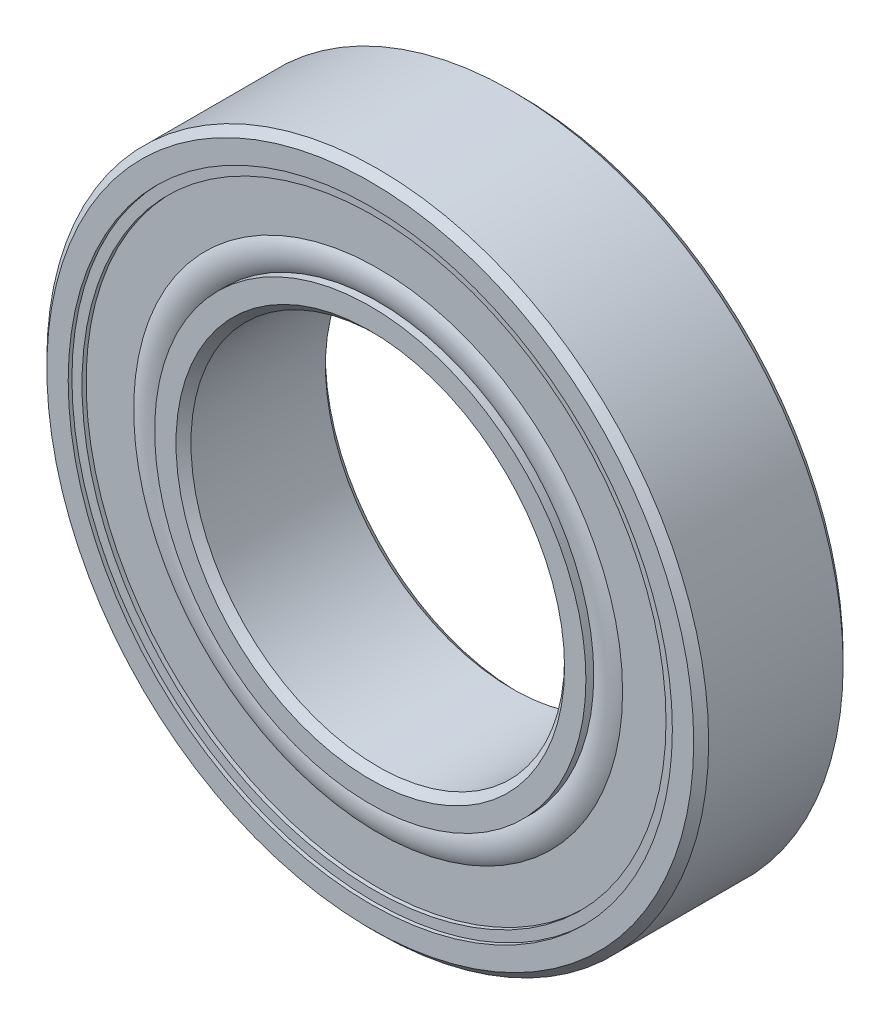
ISO-10303-21;
HEADER;
FILE_DESCRIPTION(('STEP AP214'),'2;1');
FILE_NAME('part.step','',(''),(''),'','','');
FILE_SCHEMA(('AUTOMOTIVE_DESIGN { 1 0 10303 214 1 1 1 1 }'));
ENDSEC;
DATA;
#1=APPLICATION_CONTEXT('core data for automotive mechanical design processes');
#2=APPLICATION_PROTOCOL_DEFINITION('international standard','automotive_design',2000,#1);
#3=PRODUCT_CONTEXT('',#1,'mechanical');
#4=PRODUCT('Part','Part','',(#3));
#5=PRODUCT_RELATED_PRODUCT_CATEGORY('part','',(#4));
#6=PRODUCT_DEFINITION_FORMATION('','',#4);
#7=PRODUCT_DEFINITION_CONTEXT('part definition',#1,'design');
#8=PRODUCT_DEFINITION('design','',#6,#7);
#9=PRODUCT_DEFINITION_SHAPE('','',#8);
#10=(LENGTH_UNIT() NAMED_UNIT(*) SI_UNIT(.MILLI.,.METRE.));
#11=(NAMED_UNIT(*) PLANE_ANGLE_UNIT() SI_UNIT($,.RADIAN.));
#12=(NAMED_UNIT(*) SI_UNIT($,.STERADIAN.) SOLID_ANGLE_UNIT());
#13=UNCERTAINTY_MEASURE_WITH_UNIT(LENGTH_MEASURE(1.E-05),#10,'distance_accuracy_value','');
#14=(GEOMETRIC_REPRESENTATION_CONTEXT(3) GLOBAL_UNCERTAINTY_ASSIGNED_CONTEXT((#13)) GLOBAL_UNIT_ASSIGNED_CONTEXT((#10,
#11,#12)) REPRESENTATION_CONTEXT('',''));
#15=CARTESIAN_POINT('',(0.,0.,0.));
#16=DIRECTION('',(0.,0.,1.));
#17=DIRECTION('',(1.,0.,0.));
#18=AXIS2_PLACEMENT_3D('',#15,#16,#17);
#19=CARTESIAN_POINT('',(0.,0.,-4.09483501012353));
#20=DIRECTION('',(0.,0.,1.));
#21=DIRECTION('',(1.,0.,0.));
#22=AXIS2_PLACEMENT_3D('',#19,#20,#21);
#23=TOROIDAL_SURFACE('',#22,21.55,2.55516498987648);
#24=CARTESIAN_POINT('',(0.,0.,-6.26425155046115));
#25=DIRECTION('',(0.,0.,1.));
#26=DIRECTION('',(1.,0.,0.));
#27=AXIS2_PLACEMENT_3D('',#24,#25,#26);
#28=CIRCLE('',#27,22.9);
#29=CARTESIAN_POINT('',(22.9,0.,-6.26425155046115));
#30=VERTEX_POINT('',#29);
#31=EDGE_CURVE('E11',#30,#30,#28,.T.);
#32=ORIENTED_EDGE('',*,*,#31,.F.);
#33=EDGE_LOOP('',(#32));
#34=FACE_BOUND('',#33,.T.);
#35=CARTESIAN_POINT('',(0.,0.,-6.26425155046115));
#36=DIRECTION('',(0.,0.,1.));
#37=DIRECTION('',(1.,0.,0.));
#38=AXIS2_PLACEMENT_3D('',#35,#36,#37);
#39=CIRCLE('',#38,20.2);
#40=CARTESIAN_POINT('',(20.2,0.,-6.26425155046115));
#41=VERTEX_POINT('',#40);
#42=EDGE_CURVE('E83',#41,#41,#39,.T.);
#43=ORIENTED_EDGE('',*,*,#42,.T.);
#44=EDGE_LOOP('',(#43));
#45=FACE_BOUND('',#44,.T.);
#46=ADVANCED_FACE('F50',(#34,#45),#23,.T.);
#47=CARTESIAN_POINT('',(0.,27.355,-6.26425155046115));
#48=DIRECTION('',(0.,0.,1.));
#49=DIRECTION('',(1.,0.,0.));
#50=AXIS2_PLACEMENT_3D('',#47,#48,#49);
#51=PLANE('',#50);
#52=CARTESIAN_POINT('',(0.,0.,-6.26425155046115));
#53=DIRECTION('',(0.,0.,1.));
#54=DIRECTION('',(1.,0.,0.));
#55=AXIS2_PLACEMENT_3D('',#52,#53,#54);
#56=CIRCLE('',#55,27.355);
#57=CARTESIAN_POINT('',(27.355,0.,-6.26425155046115));
#58=VERTEX_POINT('',#57);
#59=EDGE_CURVE('E57',#58,#58,#56,.T.);
#60=ORIENTED_EDGE('',*,*,#59,.F.);
#61=EDGE_LOOP('',(#60));
#62=FACE_BOUND('',#61,.T.);
#63=ORIENTED_EDGE('',*,*,#31,.T.);
#64=EDGE_LOOP('',(#63));
#65=FACE_BOUND('',#64,.T.);
#66=ADVANCED_FACE('F116',(#62,#65),#51,.F.);
#67=CARTESIAN_POINT('',(0.,0.,7.));
#68=DIRECTION('',(0.,0.,1.));
#69=DIRECTION('',(1.,0.,0.));
#70=AXIS2_PLACEMENT_3D('',#67,#68,#69);
#71=CYLINDRICAL_SURFACE('',#70,27.355);
#72=CARTESIAN_POINT('',(0.,0.,-6.65));
#73=DIRECTION('',(0.,0.,1.));
#74=DIRECTION('',(1.,0.,0.));
#75=AXIS2_PLACEMENT_3D('',#72,#73,#74);
#76=CIRCLE('',#75,27.355);
#77=CARTESIAN_POINT('',(27.355,0.,-6.65));
#78=VERTEX_POINT('',#77);
#79=EDGE_CURVE('E63',#78,#78,#76,.T.);
#80=ORIENTED_EDGE('',*,*,#79,.F.);
#81=EDGE_LOOP('',(#80));
#82=FACE_BOUND('',#81,.T.);
#83=ORIENTED_EDGE('',*,*,#59,.T.);
#84=EDGE_LOOP('',(#83));
#85=FACE_BOUND('',#84,.T.);
#86=ADVANCED_FACE('F111',(#82,#85),#71,.F.);
#87=CARTESIAN_POINT('',(0.,28.3,-6.65));
#88=DIRECTION('',(0.,0.,1.));
#89=DIRECTION('',(1.,0.,0.));
#90=AXIS2_PLACEMENT_3D('',#87,#88,#89);
#91=PLANE('',#90);
#92=CARTESIAN_POINT('',(0.,0.,-6.65));
#93=DIRECTION('',(0.,0.,1.));
#94=DIRECTION('',(1.,0.,0.));
#95=AXIS2_PLACEMENT_3D('',#92,#93,#94);
#96=CIRCLE('',#95,28.3);
#97=CARTESIAN_POINT('',(28.3,0.,-6.65));
#98=VERTEX_POINT('',#97);
#99=EDGE_CURVE('E69',#98,#98,#96,.T.);
#100=ORIENTED_EDGE('',*,*,#99,.F.);
#101=EDGE_LOOP('',(#100));
#102=FACE_BOUND('',#101,.T.);
#103=ORIENTED_EDGE('',*,*,#79,.T.);
#104=EDGE_LOOP('',(#103));
#105=FACE_BOUND('',#104,.T.);
#106=ADVANCED_FACE('F105',(#102,#105),#91,.F.);
#107=CARTESIAN_POINT('',(0.,0.,7.));
#108=DIRECTION('',(0.,0.,1.));
#109=DIRECTION('',(1.,0.,0.));
#110=AXIS2_PLACEMENT_3D('',#107,#108,#109);
#111=CYLINDRICAL_SURFACE('',#110,28.3);
#112=CARTESIAN_POINT('',(0.,0.,-5.10700620184458));
#113=DIRECTION('',(0.,0.,1.));
#114=DIRECTION('',(1.,0.,0.));
#115=AXIS2_PLACEMENT_3D('',#112,#113,#114);
#116=CIRCLE('',#115,28.3);
#117=CARTESIAN_POINT('',(28.3,0.,-5.10700620184458));
#118=VERTEX_POINT('',#117);
#119=EDGE_CURVE('E75',#118,#118,#116,.T.);
#120=ORIENTED_EDGE('',*,*,#119,.F.);
#121=EDGE_LOOP('',(#120));
#122=FACE_BOUND('',#121,.T.);
#123=ORIENTED_EDGE('',*,*,#99,.T.);
#124=EDGE_LOOP('',(#123));
#125=FACE_BOUND('',#124,.T.);
#126=ADVANCED_FACE('F99',(#122,#125),#111,.T.);
#127=CARTESIAN_POINT('',(0.,28.3,-5.10700620184458));
#128=DIRECTION('',(0.,0.,-1.));
#129=DIRECTION('',(-1.,0.,0.));
#130=AXIS2_PLACEMENT_3D('',#127,#128,#129);
#131=PLANE('',#130);
#132=CARTESIAN_POINT('',(0.,0.,-5.10700620184458));
#133=DIRECTION('',(0.,0.,1.));
#134=DIRECTION('',(1.,0.,0.));
#135=AXIS2_PLACEMENT_3D('',#132,#133,#134);
#136=CIRCLE('',#135,20.2);
#137=CARTESIAN_POINT('',(20.2,0.,-5.10700620184458));
#138=VERTEX_POINT('',#137);
#139=EDGE_CURVE('E79',#138,#138,#136,.T.);
#140=ORIENTED_EDGE('',*,*,#139,.F.);
#141=EDGE_LOOP('',(#140));
#142=FACE_BOUND('',#141,.T.);
#143=ORIENTED_EDGE('',*,*,#119,.T.);
#144=EDGE_LOOP('',(#143));
#145=FACE_BOUND('',#144,.T.);
#146=ADVANCED_FACE('F93',(#142,#145),#131,.F.);
#147=CARTESIAN_POINT('',(0.,0.,7.));
#148=DIRECTION('',(0.,0.,1.));
#149=DIRECTION('',(1.,0.,0.));
#150=AXIS2_PLACEMENT_3D('',#147,#148,#149);
#151=CYLINDRICAL_SURFACE('',#150,20.2);
#152=ORIENTED_EDGE('',*,*,#42,.F.);
#153=EDGE_LOOP('',(#152));
#154=FACE_BOUND('',#153,.T.);
#155=ORIENTED_EDGE('',*,*,#139,.T.);
#156=EDGE_LOOP('',(#155));
#157=FACE_BOUND('',#156,.T.);
#158=ADVANCED_FACE('F90',(#154,#157),#151,.F.);
#159=CLOSED_SHELL('',(#46,#66,#86,#106,#126,#146,#158));
#160=MANIFOLD_SOLID_BREP('B2',#159);
#161=CARTESIAN_POINT('',(0.,28.3,6.65));
#162=DIRECTION('',(0.,0.,-1.));
#163=DIRECTION('',(-1.,0.,0.));
#164=AXIS2_PLACEMENT_3D('',#161,#162,#163);
#165=PLANE('',#164);
#166=CARTESIAN_POINT('',(0.,0.,6.65));
#167=DIRECTION('',(0.,0.,1.));
#168=DIRECTION('',(1.,0.,0.));
#169=AXIS2_PLACEMENT_3D('',#166,#167,#168);
#170=CIRCLE('',#169,27.355);
#171=CARTESIAN_POINT('',(27.355,0.,6.65));
#172=VERTEX_POINT('',#171);
#173=EDGE_CURVE('E210',#172,#172,#170,.T.);
#174=ORIENTED_EDGE('',*,*,#173,.F.);
#175=EDGE_LOOP('',(#174));
#176=FACE_BOUND('',#175,.T.);
#177=CARTESIAN_POINT('',(0.,0.,6.65));
#178=DIRECTION('',(0.,0.,1.));
#179=DIRECTION('',(1.,0.,0.));
#180=AXIS2_PLACEMENT_3D('',#177,#178,#179);
#181=CIRCLE('',#180,28.3);
#182=CARTESIAN_POINT('',(28.3,0.,6.65));
#183=VERTEX_POINT('',#182);
#184=EDGE_CURVE('E49',#183,#183,#181,.T.);
#185=ORIENTED_EDGE('',*,*,#184,.T.);
#186=EDGE_LOOP('',(#185));
#187=FACE_BOUND('',#186,.T.);
#188=ADVANCED_FACE('F177',(#176,#187),#165,.F.);
#189=CARTESIAN_POINT('',(0.,0.,7.));
#190=DIRECTION('',(0.,0.,1.));
#191=DIRECTION('',(1.,0.,0.));
#192=AXIS2_PLACEMENT_3D('',#189,#190,#191);
#193=CYLINDRICAL_SURFACE('',#192,28.3);
#194=ORIENTED_EDGE('',*,*,#184,.F.);
#195=EDGE_LOOP('',(#194));
#196=FACE_BOUND('',#195,.T.);
#197=CARTESIAN_POINT('',(0.,0.,5.10700620184458));
#198=DIRECTION('',(0.,0.,1.));
#199=DIRECTION('',(1.,0.,0.));
#200=AXIS2_PLACEMENT_3D('',#197,#198,#199);
#201=CIRCLE('',#200,28.3);
#202=CARTESIAN_POINT('',(28.3,0.,5.10700620184458));
#203=VERTEX_POINT('',#202);
#204=EDGE_CURVE('E184',#203,#203,#201,.T.);
#205=ORIENTED_EDGE('',*,*,#204,.T.);
#206=EDGE_LOOP('',(#205));
#207=FACE_BOUND('',#206,.T.);
#208=ADVANCED_FACE('F219',(#196,#207),#193,.T.);
#209=CARTESIAN_POINT('',(0.,28.3,5.10700620184458));
#210=DIRECTION('',(0.,0.,1.));
#211=DIRECTION('',(1.,0.,0.));
#212=AXIS2_PLACEMENT_3D('',#209,#210,#211);
#213=PLANE('',#212);
#214=ORIENTED_EDGE('',*,*,#204,.F.);
#215=EDGE_LOOP('',(#214));
#216=FACE_BOUND('',#215,.T.);
#217=CARTESIAN_POINT('',(0.,0.,5.10700620184458));
#218=DIRECTION('',(0.,0.,1.));
#219=DIRECTION('',(1.,0.,0.));
#220=AXIS2_PLACEMENT_3D('',#217,#218,#219);
#221=CIRCLE('',#220,20.2);
#222=CARTESIAN_POINT('',(20.2,0.,5.10700620184458));
#223=VERTEX_POINT('',#222);
#224=EDGE_CURVE('E190',#223,#223,#221,.T.);
#225=ORIENTED_EDGE('',*,*,#224,.T.);
#226=EDGE_LOOP('',(#225));
#227=FACE_BOUND('',#226,.T.);
#228=ADVANCED_FACE('F223',(#216,#227),#213,.F.);
#229=CARTESIAN_POINT('',(0.,0.,7.));
#230=DIRECTION('',(0.,0.,1.));
#231=DIRECTION('',(1.,0.,0.));
#232=AXIS2_PLACEMENT_3D('',#229,#230,#231);
#233=CYLINDRICAL_SURFACE('',#232,20.2);
#234=ORIENTED_EDGE('',*,*,#224,.F.);
#235=EDGE_LOOP('',(#234));
#236=FACE_BOUND('',#235,.T.);
#237=CARTESIAN_POINT('',(0.,0.,6.26425155046115));
#238=DIRECTION('',(0.,0.,1.));
#239=DIRECTION('',(1.,0.,0.));
#240=AXIS2_PLACEMENT_3D('',#237,#238,#239);
#241=CIRCLE('',#240,20.2);
#242=CARTESIAN_POINT('',(20.2,0.,6.26425155046115));
#243=VERTEX_POINT('',#242);
#244=EDGE_CURVE('E196',#243,#243,#241,.T.);
#245=ORIENTED_EDGE('',*,*,#244,.T.);
#246=EDGE_LOOP('',(#245));
#247=FACE_BOUND('',#246,.T.);
#248=ADVANCED_FACE('F228',(#236,#247),#233,.F.);
#249=CARTESIAN_POINT('',(0.,0.,4.09483501012352));
#250=DIRECTION('',(0.,0.,1.));
#251=DIRECTION('',(1.,0.,0.));
#252=AXIS2_PLACEMENT_3D('',#249,#250,#251);
#253=TOROIDAL_SURFACE('',#252,21.55,2.55516498987648);
#254=ORIENTED_EDGE('',*,*,#244,.F.);
#255=EDGE_LOOP('',(#254));
#256=FACE_BOUND('',#255,.T.);
#257=CARTESIAN_POINT('',(0.,0.,6.26425155046115));
#258=DIRECTION('',(0.,0.,1.));
#259=DIRECTION('',(1.,0.,0.));
#260=AXIS2_PLACEMENT_3D('',#257,#258,#259);
#261=CIRCLE('',#260,22.9);
#262=CARTESIAN_POINT('',(22.9,0.,6.26425155046115));
#263=VERTEX_POINT('',#262);
#264=EDGE_CURVE('E202',#263,#263,#261,.T.);
#265=ORIENTED_EDGE('',*,*,#264,.T.);
#266=EDGE_LOOP('',(#265));
#267=FACE_BOUND('',#266,.T.);
#268=ADVANCED_FACE('F234',(#256,#267),#253,.T.);
#269=CARTESIAN_POINT('',(0.,27.355,6.26425155046115));
#270=DIRECTION('',(0.,0.,-1.));
#271=DIRECTION('',(-1.,0.,0.));
#272=AXIS2_PLACEMENT_3D('',#269,#270,#271);
#273=PLANE('',#272);
#274=ORIENTED_EDGE('',*,*,#264,.F.);
#275=EDGE_LOOP('',(#274));
#276=FACE_BOUND('',#275,.T.);
#277=CARTESIAN_POINT('',(0.,0.,6.26425155046115));
#278=DIRECTION('',(0.,0.,1.));
#279=DIRECTION('',(1.,0.,0.));
#280=AXIS2_PLACEMENT_3D('',#277,#278,#279);
#281=CIRCLE('',#280,27.355);
#282=CARTESIAN_POINT('',(27.355,0.,6.26425155046115));
#283=VERTEX_POINT('',#282);
#284=EDGE_CURVE('E206',#283,#283,#281,.T.);
#285=ORIENTED_EDGE('',*,*,#284,.T.);
#286=EDGE_LOOP('',(#285));
#287=FACE_BOUND('',#286,.T.);
#288=ADVANCED_FACE('F238',(#276,#287),#273,.F.);
#289=CARTESIAN_POINT('',(0.,0.,7.));
#290=DIRECTION('',(0.,0.,1.));
#291=DIRECTION('',(1.,0.,0.));
#292=AXIS2_PLACEMENT_3D('',#289,#290,#291);
#293=CYLINDRICAL_SURFACE('',#292,27.355);
#294=ORIENTED_EDGE('',*,*,#284,.F.);
#295=EDGE_LOOP('',(#294));
#296=FACE_BOUND('',#295,.T.);
#297=ORIENTED_EDGE('',*,*,#173,.T.);
#298=EDGE_LOOP('',(#297));
#299=FACE_BOUND('',#298,.T.);
#300=ADVANCED_FACE('F216',(#296,#299),#293,.F.);
#301=CLOSED_SHELL('',(#188,#208,#228,#248,#268,#288,#300));
#302=MANIFOLD_SOLID_BREP('B6',#301);
#303=CARTESIAN_POINT('',(-14.2537923680922,19.6186621135927,0.));
#304=DIRECTION('',(0.,0.,1.));
#305=DIRECTION('',(-0.587785252292462,0.809016994374955,0.));
#306=AXIS2_PLACEMENT_3D('',#303,#304,#305);
#307=SPHERICAL_SURFACE('',#306,5.10700620184458);
#308=CARTESIAN_POINT('',(-14.2537923680922,19.6186621135927,5.10700620184458));
#309=VERTEX_POINT('',#308);
#310=VERTEX_LOOP('',#309);
#311=FACE_BOUND('',#310,.T.);
#312=ADVANCED_FACE('F304',(#311),#307,.T.);
#313=CLOSED_SHELL('',(#312));
#314=MANIFOLD_SOLID_BREP('B44',#313);
#315=CARTESIAN_POINT('',(-23.0631205201574,7.49366211359274,0.));
#316=DIRECTION('',(0.,0.,1.));
#317=DIRECTION('',(-0.95105651629515,0.309016994374958,0.));
#318=AXIS2_PLACEMENT_3D('',#315,#316,#317);
#319=SPHERICAL_SURFACE('',#318,5.10700620184458);
#320=CARTESIAN_POINT('',(-23.0631205201574,7.49366211359274,5.10700620184458));
#321=VERTEX_POINT('',#320);
#322=VERTEX_LOOP('',#321);
#323=FACE_BOUND('',#322,.T.);
#324=ADVANCED_FACE('F323',(#323),#319,.T.);
#325=CLOSED_SHELL('',(#324));
#326=MANIFOLD_SOLID_BREP('B173',#325);
#327=CARTESIAN_POINT('',(-23.0631205201575,-7.49366211359225,0.));
#328=DIRECTION('',(0.,0.,1.));
#329=DIRECTION('',(-0.951056516295157,-0.309016994374938,0.));
#330=AXIS2_PLACEMENT_3D('',#327,#328,#329);
#331=SPHERICAL_SURFACE('',#330,5.10700620184458);
#332=CARTESIAN_POINT('',(-23.0631205201575,-7.49366211359225,5.10700620184458));
#333=VERTEX_POINT('',#332);
#334=VERTEX_LOOP('',#333);
#335=FACE_BOUND('',#334,.T.);
#336=ADVANCED_FACE('F342',(#335),#331,.T.);
#337=CLOSED_SHELL('',(#336));
#338=MANIFOLD_SOLID_BREP('B300',#337);
#339=CARTESIAN_POINT('',(-14.2537923680926,-19.6186621135924,0.));
#340=DIRECTION('',(0.,0.,1.));
#341=DIRECTION('',(-0.58778525229248,-0.809016994374942,0.));
#342=AXIS2_PLACEMENT_3D('',#339,#340,#341);
#343=SPHERICAL_SURFACE('',#342,5.10700620184458);
#344=CARTESIAN_POINT('',(-14.2537923680926,-19.6186621135924,5.10700620184458));
#345=VERTEX_POINT('',#344);
#346=VERTEX_LOOP('',#345);
#347=FACE_BOUND('',#346,.T.);
#348=ADVANCED_FACE('F361',(#347),#343,.T.);
#349=CLOSED_SHELL('',(#348));
#350=MANIFOLD_SOLID_BREP('B319',#349);
#351=CARTESIAN_POINT('',(-1.69336844933892E-13,-24.25,0.));
#352=DIRECTION('',(0.,0.,1.));
#353=DIRECTION('',(0.,-1.,0.));
#354=AXIS2_PLACEMENT_3D('',#351,#352,#353);
#355=SPHERICAL_SURFACE('',#354,5.10700620184458);
#356=CARTESIAN_POINT('',(-1.69336844933892E-13,-24.25,5.10700620184458));
#357=VERTEX_POINT('',#356);
#358=VERTEX_LOOP('',#357);
#359=FACE_BOUND('',#358,.T.);
#360=ADVANCED_FACE('F380',(#359),#355,.T.);
#361=CLOSED_SHELL('',(#360));
#362=MANIFOLD_SOLID_BREP('B338',#361);
#363=CARTESIAN_POINT('',(14.2537923680924,-19.6186621135926,0.));
#364=DIRECTION('',(0.,0.,1.));
#365=DIRECTION('',(0.587785252292469,-0.809016994374951,0.));
#366=AXIS2_PLACEMENT_3D('',#363,#364,#365);
#367=SPHERICAL_SURFACE('',#366,5.10700620184458);
#368=CARTESIAN_POINT('',(14.2537923680924,-19.6186621135926,5.10700620184458));
#369=VERTEX_POINT('',#368);
#370=VERTEX_LOOP('',#369);
#371=FACE_BOUND('',#370,.T.);
#372=ADVANCED_FACE('F399',(#371),#367,.T.);
#373=CLOSED_SHELL('',(#372));
#374=MANIFOLD_SOLID_BREP('B357',#373);
#375=CARTESIAN_POINT('',(23.0631205201574,-7.49366211359258,0.));
#376=DIRECTION('',(0.,0.,1.));
#377=DIRECTION('',(0.951056516295152,-0.309016994374952,0.));
#378=AXIS2_PLACEMENT_3D('',#375,#376,#377);
#379=SPHERICAL_SURFACE('',#378,5.10700620184458);
#380=CARTESIAN_POINT('',(23.0631205201574,-7.49366211359258,5.10700620184458));
#381=VERTEX_POINT('',#380);
#382=VERTEX_LOOP('',#381);
#383=FACE_BOUND('',#382,.T.);
#384=ADVANCED_FACE('F418',(#383),#379,.T.);
#385=CLOSED_SHELL('',(#384));
#386=MANIFOLD_SOLID_BREP('B376',#385);
#387=CARTESIAN_POINT('',(23.0631205201575,7.49366211359241,0.));
#388=DIRECTION('',(0.,0.,1.));
#389=DIRECTION('',(0.951056516295155,0.309016994374945,0.));
#390=AXIS2_PLACEMENT_3D('',#387,#388,#389);
#391=SPHERICAL_SURFACE('',#390,5.10700620184458);
#392=CARTESIAN_POINT('',(23.0631205201575,7.49366211359241,5.10700620184458));
#393=VERTEX_POINT('',#392);
#394=VERTEX_LOOP('',#393);
#395=FACE_BOUND('',#394,.T.);
#396=ADVANCED_FACE('F437',(#395),#391,.T.);
#397=CLOSED_SHELL('',(#396));
#398=MANIFOLD_SOLID_BREP('B395',#397);
#399=CARTESIAN_POINT('',(14.2537923680925,19.6186621135925,0.));
#400=DIRECTION('',(0.,0.,1.));
#401=DIRECTION('',(0.587785252292474,0.809016994374947,0.));
#402=AXIS2_PLACEMENT_3D('',#399,#400,#401);
#403=SPHERICAL_SURFACE('',#402,5.10700620184458);
#404=CARTESIAN_POINT('',(14.2537923680925,19.6186621135925,5.10700620184458));
#405=VERTEX_POINT('',#404);
#406=VERTEX_LOOP('',#405);
#407=FACE_BOUND('',#406,.T.);
#408=ADVANCED_FACE('F456',(#407),#403,.T.);
#409=CLOSED_SHELL('',(#408));
#410=MANIFOLD_SOLID_BREP('B414',#409);
#411=CARTESIAN_POINT('',(0.,24.25,0.));
#412=DIRECTION('',(0.,0.,1.));
#413=DIRECTION('',(0.,1.,0.));
#414=AXIS2_PLACEMENT_3D('',#411,#412,#413);
#415=SPHERICAL_SURFACE('',#414,5.10700620184458);
#416=CARTESIAN_POINT('',(0.,24.25,5.10700620184458));
#417=VERTEX_POINT('',#416);
#418=VERTEX_LOOP('',#417);
#419=FACE_BOUND('',#418,.T.);
#420=ADVANCED_FACE('F477',(#419),#415,.T.);
#421=CLOSED_SHELL('',(#420));
#422=MANIFOLD_SOLID_BREP('B433',#421);
#423=CARTESIAN_POINT('',(0.,0.,7.));
#424=DIRECTION('',(0.,0.,1.));
#425=DIRECTION('',(1.,0.,0.));
#426=AXIS2_PLACEMENT_3D('',#423,#424,#425);
#427=CONICAL_SURFACE('',#426,18.2,0.785398163397455);
#428=CARTESIAN_POINT('',(0.,0.,6.3));
#429=DIRECTION('',(0.,0.,1.));
#430=DIRECTION('',(1.,0.,0.));
#431=AXIS2_PLACEMENT_3D('',#428,#429,#430);
#432=CIRCLE('',#431,17.5);
#433=CARTESIAN_POINT('',(17.5,0.,6.3));
#434=VERTEX_POINT('',#433);
#435=EDGE_CURVE('E476',#434,#434,#432,.T.);
#436=ORIENTED_EDGE('',*,*,#435,.F.);
#437=EDGE_LOOP('',(#436));
#438=FACE_BOUND('',#437,.T.);
#439=CARTESIAN_POINT('',(0.,0.,7.));
#440=DIRECTION('',(0.,0.,1.));
#441=DIRECTION('',(1.,0.,0.));
#442=AXIS2_PLACEMENT_3D('',#439,#440,#441);
#443=CIRCLE('',#442,18.2);
#444=CARTESIAN_POINT('',(18.2,0.,7.));
#445=VERTEX_POINT('',#444);
#446=EDGE_CURVE('E534',#445,#445,#443,.T.);
#447=ORIENTED_EDGE('',*,*,#446,.T.);
#448=EDGE_LOOP('',(#447));
#449=FACE_BOUND('',#448,.T.);
#450=ADVANCED_FACE('F497',(#438,#449),#427,.F.);
#451=CARTESIAN_POINT('',(0.,0.,7.));
#452=DIRECTION('',(0.,0.,1.));
#453=DIRECTION('',(1.,0.,0.));
#454=AXIS2_PLACEMENT_3D('',#451,#452,#453);
#455=CYLINDRICAL_SURFACE('',#454,17.5);
#456=CARTESIAN_POINT('',(0.,0.,-6.3));
#457=DIRECTION('',(0.,0.,1.));
#458=DIRECTION('',(1.,0.,0.));
#459=AXIS2_PLACEMENT_3D('',#456,#457,#458);
#460=CIRCLE('',#459,17.5);
#461=CARTESIAN_POINT('',(17.5,0.,-6.3));
#462=VERTEX_POINT('',#461);
#463=EDGE_CURVE('E504',#462,#462,#460,.T.);
#464=ORIENTED_EDGE('',*,*,#463,.F.);
#465=EDGE_LOOP('',(#464));
#466=FACE_BOUND('',#465,.T.);
#467=ORIENTED_EDGE('',*,*,#435,.T.);
#468=EDGE_LOOP('',(#467));
#469=FACE_BOUND('',#468,.T.);
#470=ADVANCED_FACE('F573',(#466,#469),#455,.F.);
#471=CARTESIAN_POINT('',(0.,0.,-6.3));
#472=DIRECTION('',(0.,0.,-1.));
#473=DIRECTION('',(-1.,0.,0.));
#474=AXIS2_PLACEMENT_3D('',#471,#472,#473);
#475=CONICAL_SURFACE('',#474,17.5,0.785398163397456);
#476=CARTESIAN_POINT('',(0.,0.,-7.));
#477=DIRECTION('',(0.,0.,1.));
#478=DIRECTION('',(1.,0.,0.));
#479=AXIS2_PLACEMENT_3D('',#476,#477,#478);
#480=CIRCLE('',#479,18.2);
#481=CARTESIAN_POINT('',(18.2,0.,-7.));
#482=VERTEX_POINT('',#481);
#483=EDGE_CURVE('E510',#482,#482,#480,.T.);
#484=ORIENTED_EDGE('',*,*,#483,.F.);
#485=EDGE_LOOP('',(#484));
#486=FACE_BOUND('',#485,.T.);
#487=ORIENTED_EDGE('',*,*,#463,.T.);
#488=EDGE_LOOP('',(#487));
#489=FACE_BOUND('',#488,.T.);
#490=ADVANCED_FACE('F568',(#486,#489),#475,.F.);
#491=CARTESIAN_POINT('',(0.,18.2,-7.));
#492=DIRECTION('',(0.,0.,1.));
#493=DIRECTION('',(1.,0.,0.));
#494=AXIS2_PLACEMENT_3D('',#491,#492,#493);
#495=PLANE('',#494);
#496=CARTESIAN_POINT('',(0.,0.,-7.));
#497=DIRECTION('',(0.,0.,1.));
#498=DIRECTION('',(1.,0.,0.));
#499=AXIS2_PLACEMENT_3D('',#496,#497,#498);
#500=CIRCLE('',#499,20.2);
#501=CARTESIAN_POINT('',(20.2,0.,-7.));
#502=VERTEX_POINT('',#501);
#503=EDGE_CURVE('E516',#502,#502,#500,.T.);
#504=ORIENTED_EDGE('',*,*,#503,.F.);
#505=EDGE_LOOP('',(#504));
#506=FACE_BOUND('',#505,.T.);
#507=ORIENTED_EDGE('',*,*,#483,.T.);
#508=EDGE_LOOP('',(#507));
#509=FACE_BOUND('',#508,.T.);
#510=ADVANCED_FACE('F562',(#506,#509),#495,.F.);
#511=CARTESIAN_POINT('',(0.,0.,7.));
#512=DIRECTION('',(0.,0.,1.));
#513=DIRECTION('',(1.,0.,0.));
#514=AXIS2_PLACEMENT_3D('',#511,#512,#513);
#515=CYLINDRICAL_SURFACE('',#514,20.2);
#516=CARTESIAN_POINT('',(0.,0.,-3.11111111111111));
#517=DIRECTION('',(0.,0.,1.));
#518=DIRECTION('',(1.,0.,0.));
#519=AXIS2_PLACEMENT_3D('',#516,#517,#518);
#520=CIRCLE('',#519,20.2);
#521=CARTESIAN_POINT('',(20.2,0.,-3.11111111111111));
#522=VERTEX_POINT('',#521);
#523=EDGE_CURVE('E522',#522,#522,#520,.T.);
#524=ORIENTED_EDGE('',*,*,#523,.F.);
#525=EDGE_LOOP('',(#524));
#526=FACE_BOUND('',#525,.T.);
#527=ORIENTED_EDGE('',*,*,#503,.T.);
#528=EDGE_LOOP('',(#527));
#529=FACE_BOUND('',#528,.T.);
#530=ADVANCED_FACE('F556',(#526,#529),#515,.T.);
#531=CARTESIAN_POINT('',(0.,0.,0.));
#532=DIRECTION('',(0.,0.,1.));
#533=DIRECTION('',(1.,0.,0.));
#534=AXIS2_PLACEMENT_3D('',#531,#532,#533);
#535=TOROIDAL_SURFACE('',#534,24.25,5.10700620184458);
#536=CARTESIAN_POINT('',(0.,0.,3.11111111111111));
#537=DIRECTION('',(0.,0.,1.));
#538=DIRECTION('',(1.,0.,0.));
#539=AXIS2_PLACEMENT_3D('',#536,#537,#538);
#540=CIRCLE('',#539,20.2);
#541=CARTESIAN_POINT('',(20.2,0.,3.11111111111111));
#542=VERTEX_POINT('',#541);
#543=EDGE_CURVE('E526',#542,#542,#540,.T.);
#544=ORIENTED_EDGE('',*,*,#543,.F.);
#545=EDGE_LOOP('',(#544));
#546=FACE_BOUND('',#545,.T.);
#547=ORIENTED_EDGE('',*,*,#523,.T.);
#548=EDGE_LOOP('',(#547));
#549=FACE_BOUND('',#548,.T.);
#550=ADVANCED_FACE('F550',(#546,#549),#535,.F.);
#551=CARTESIAN_POINT('',(0.,0.,7.));
#552=DIRECTION('',(0.,0.,1.));
#553=DIRECTION('',(1.,0.,0.));
#554=AXIS2_PLACEMENT_3D('',#551,#552,#553);
#555=CYLINDRICAL_SURFACE('',#554,20.2);
#556=CARTESIAN_POINT('',(0.,0.,7.));
#557=DIRECTION('',(0.,0.,1.));
#558=DIRECTION('',(1.,0.,0.));
#559=AXIS2_PLACEMENT_3D('',#556,#557,#558);
#560=CIRCLE('',#559,20.2);
#561=CARTESIAN_POINT('',(20.2,0.,7.));
#562=VERTEX_POINT('',#561);
#563=EDGE_CURVE('E530',#562,#562,#560,.T.);
#564=ORIENTED_EDGE('',*,*,#563,.F.);
#565=EDGE_LOOP('',(#564));
#566=FACE_BOUND('',#565,.T.);
#567=ORIENTED_EDGE('',*,*,#543,.T.);
#568=EDGE_LOOP('',(#567));
#569=FACE_BOUND('',#568,.T.);
#570=ADVANCED_FACE('F544',(#566,#569),#555,.T.);
#571=CARTESIAN_POINT('',(0.,18.2,7.));
#572=DIRECTION('',(0.,0.,-1.));
#573=DIRECTION('',(-1.,0.,0.));
#574=AXIS2_PLACEMENT_3D('',#571,#572,#573);
#575=PLANE('',#574);
#576=ORIENTED_EDGE('',*,*,#446,.F.);
#577=EDGE_LOOP('',(#576));
#578=FACE_BOUND('',#577,.T.);
#579=ORIENTED_EDGE('',*,*,#563,.T.);
#580=EDGE_LOOP('',(#579));
#581=FACE_BOUND('',#580,.T.);
#582=ADVANCED_FACE('F541',(#578,#581),#575,.F.);
#583=CLOSED_SHELL('',(#450,#470,#490,#510,#530,#550,#570,#582));
#584=MANIFOLD_SOLID_BREP('B452',#583);
#585=CARTESIAN_POINT('',(0.,0.,6.3));
#586=DIRECTION('',(0.,0.,-1.));
#587=DIRECTION('',(-1.,0.,0.));
#588=AXIS2_PLACEMENT_3D('',#585,#586,#587);
#589=CONICAL_SURFACE('',#588,31.,0.785398163397448);
#590=CARTESIAN_POINT('',(0.,0.,7.));
#591=DIRECTION('',(0.,0.,1.));
#592=DIRECTION('',(1.,0.,0.));
#593=AXIS2_PLACEMENT_3D('',#590,#591,#592);
#594=CIRCLE('',#593,30.3);
#595=CARTESIAN_POINT('',(30.3,0.,7.));
#596=VERTEX_POINT('',#595);
#597=EDGE_CURVE('E496',#596,#596,#594,.T.);
#598=ORIENTED_EDGE('',*,*,#597,.F.);
#599=EDGE_LOOP('',(#598));
#600=FACE_BOUND('',#599,.T.);
#601=CARTESIAN_POINT('',(0.,0.,6.3));
#602=DIRECTION('',(0.,0.,1.));
#603=DIRECTION('',(1.,0.,0.));
#604=AXIS2_PLACEMENT_3D('',#601,#602,#603);
#605=CIRCLE('',#604,31.);
#606=CARTESIAN_POINT('',(31.,0.,6.3));
#607=VERTEX_POINT('',#606);
#608=EDGE_CURVE('E672',#607,#607,#605,.T.);
#609=ORIENTED_EDGE('',*,*,#608,.T.);
#610=EDGE_LOOP('',(#609));
#611=FACE_BOUND('',#610,.T.);
#612=ADVANCED_FACE('F635',(#600,#611),#589,.T.);
#613=CARTESIAN_POINT('',(0.,30.3,7.));
#614=DIRECTION('',(0.,0.,-1.));
#615=DIRECTION('',(-1.,0.,0.));
#616=AXIS2_PLACEMENT_3D('',#613,#614,#615);
#617=PLANE('',#616);
#618=CARTESIAN_POINT('',(0.,0.,7.));
#619=DIRECTION('',(0.,0.,1.));
#620=DIRECTION('',(1.,0.,0.));
#621=AXIS2_PLACEMENT_3D('',#618,#619,#620);
#622=CIRCLE('',#621,28.3);
#623=CARTESIAN_POINT('',(28.3,0.,7.));
#624=VERTEX_POINT('',#623);
#625=EDGE_CURVE('E642',#624,#624,#622,.T.);
#626=ORIENTED_EDGE('',*,*,#625,.F.);
#627=EDGE_LOOP('',(#626));
#628=FACE_BOUND('',#627,.T.);
#629=ORIENTED_EDGE('',*,*,#597,.T.);
#630=EDGE_LOOP('',(#629));
#631=FACE_BOUND('',#630,.T.);
#632=ADVANCED_FACE('F711',(#628,#631),#617,.F.);
#633=CARTESIAN_POINT('',(0.,0.,7.));
#634=DIRECTION('',(0.,0.,1.));
#635=DIRECTION('',(1.,0.,0.));
#636=AXIS2_PLACEMENT_3D('',#633,#634,#635);
#637=CYLINDRICAL_SURFACE('',#636,28.3);
#638=CARTESIAN_POINT('',(0.,0.,3.11111111111111));
#639=DIRECTION('',(0.,0.,1.));
#640=DIRECTION('',(1.,0.,0.));
#641=AXIS2_PLACEMENT_3D('',#638,#639,#640);
#642=CIRCLE('',#641,28.3);
#643=CARTESIAN_POINT('',(28.3,0.,3.11111111111111));
#644=VERTEX_POINT('',#643);
#645=EDGE_CURVE('E648',#644,#644,#642,.T.);
#646=ORIENTED_EDGE('',*,*,#645,.F.);
#647=EDGE_LOOP('',(#646));
#648=FACE_BOUND('',#647,.T.);
#649=ORIENTED_EDGE('',*,*,#625,.T.);
#650=EDGE_LOOP('',(#649));
#651=FACE_BOUND('',#650,.T.);
#652=ADVANCED_FACE('F706',(#648,#651),#637,.F.);
#653=CARTESIAN_POINT('',(0.,0.,0.));
#654=DIRECTION('',(0.,0.,1.));
#655=DIRECTION('',(1.,0.,0.));
#656=AXIS2_PLACEMENT_3D('',#653,#654,#655);
#657=TOROIDAL_SURFACE('',#656,24.25,5.10700620184458);
#658=CARTESIAN_POINT('',(0.,0.,-3.11111111111111));
#659=DIRECTION('',(0.,0.,1.));
#660=DIRECTION('',(1.,0.,0.));
#661=AXIS2_PLACEMENT_3D('',#658,#659,#660);
#662=CIRCLE('',#661,28.3);
#663=CARTESIAN_POINT('',(28.3,0.,-3.11111111111111));
#664=VERTEX_POINT('',#663);
#665=EDGE_CURVE('E654',#664,#664,#662,.T.);
#666=ORIENTED_EDGE('',*,*,#665,.F.);
#667=EDGE_LOOP('',(#666));
#668=FACE_BOUND('',#667,.T.);
#669=ORIENTED_EDGE('',*,*,#645,.T.);
#670=EDGE_LOOP('',(#669));
#671=FACE_BOUND('',#670,.T.);
#672=ADVANCED_FACE('F700',(#668,#671),#657,.F.);
#673=CARTESIAN_POINT('',(0.,0.,7.));
#674=DIRECTION('',(0.,0.,1.));
#675=DIRECTION('',(1.,0.,0.));
#676=AXIS2_PLACEMENT_3D('',#673,#674,#675);
#677=CYLINDRICAL_SURFACE('',#676,28.3);
#678=CARTESIAN_POINT('',(0.,0.,-7.));
#679=DIRECTION('',(0.,0.,1.));
#680=DIRECTION('',(1.,0.,0.));
#681=AXIS2_PLACEMENT_3D('',#678,#679,#680);
#682=CIRCLE('',#681,28.3);
#683=CARTESIAN_POINT('',(28.3,0.,-7.));
#684=VERTEX_POINT('',#683);
#685=EDGE_CURVE('E660',#684,#684,#682,.T.);
#686=ORIENTED_EDGE('',*,*,#685,.F.);
#687=EDGE_LOOP('',(#686));
#688=FACE_BOUND('',#687,.T.);
#689=ORIENTED_EDGE('',*,*,#665,.T.);
#690=EDGE_LOOP('',(#689));
#691=FACE_BOUND('',#690,.T.);
#692=ADVANCED_FACE('F694',(#688,#691),#677,.F.);
#693=CARTESIAN_POINT('',(0.,30.3,-7.));
#694=DIRECTION('',(0.,0.,1.));
#695=DIRECTION('',(1.,0.,0.));
#696=AXIS2_PLACEMENT_3D('',#693,#694,#695);
#697=PLANE('',#696);
#698=CARTESIAN_POINT('',(0.,0.,-7.));
#699=DIRECTION('',(0.,0.,1.));
#700=DIRECTION('',(1.,0.,0.));
#701=AXIS2_PLACEMENT_3D('',#698,#699,#700);
#702=CIRCLE('',#701,30.3);
#703=CARTESIAN_POINT('',(30.3,0.,-7.));
#704=VERTEX_POINT('',#703);
#705=EDGE_CURVE('E664',#704,#704,#702,.T.);
#706=ORIENTED_EDGE('',*,*,#705,.F.);
#707=EDGE_LOOP('',(#706));
#708=FACE_BOUND('',#707,.T.);
#709=ORIENTED_EDGE('',*,*,#685,.T.);
#710=EDGE_LOOP('',(#709));
#711=FACE_BOUND('',#710,.T.);
#712=ADVANCED_FACE('F688',(#708,#711),#697,.F.);
#713=CARTESIAN_POINT('',(0.,0.,-7.));
#714=DIRECTION('',(0.,0.,1.));
#715=DIRECTION('',(1.,0.,0.));
#716=AXIS2_PLACEMENT_3D('',#713,#714,#715);
#717=CONICAL_SURFACE('',#716,30.3,0.785398163397456);
#718=CARTESIAN_POINT('',(0.,0.,-6.3));
#719=DIRECTION('',(0.,0.,1.));
#720=DIRECTION('',(1.,0.,0.));
#721=AXIS2_PLACEMENT_3D('',#718,#719,#720);
#722=CIRCLE('',#721,31.);
#723=CARTESIAN_POINT('',(31.,0.,-6.3));
#724=VERTEX_POINT('',#723);
#725=EDGE_CURVE('E668',#724,#724,#722,.T.);
#726=ORIENTED_EDGE('',*,*,#725,.F.);
#727=EDGE_LOOP('',(#726));
#728=FACE_BOUND('',#727,.T.);
#729=ORIENTED_EDGE('',*,*,#705,.T.);
#730=EDGE_LOOP('',(#729));
#731=FACE_BOUND('',#730,.T.);
#732=ADVANCED_FACE('F682',(#728,#731),#717,.T.);
#733=CARTESIAN_POINT('',(0.,0.,7.));
#734=DIRECTION('',(0.,0.,1.));
#735=DIRECTION('',(1.,0.,0.));
#736=AXIS2_PLACEMENT_3D('',#733,#734,#735);
#737=CYLINDRICAL_SURFACE('',#736,31.);
#738=ORIENTED_EDGE('',*,*,#608,.F.);
#739=EDGE_LOOP('',(#738));
#740=FACE_BOUND('',#739,.T.);
#741=ORIENTED_EDGE('',*,*,#725,.T.);
#742=EDGE_LOOP('',(#741));
#743=FACE_BOUND('',#742,.T.);
#744=ADVANCED_FACE('F679',(#740,#743),#737,.T.);
#745=CLOSED_SHELL('',(#612,#632,#652,#672,#692,#712,#732,#744));
#746=MANIFOLD_SOLID_BREP('B471',#745);
#747=ADVANCED_BREP_SHAPE_REPRESENTATION('',(#18,#160,#302,#314,#326,#338,#350,#362,#374,#386,
#398,#410,#422,#584,#746),#14);
#748=SHAPE_DEFINITION_REPRESENTATION(#9,#747);
ENDSEC;
END-ISO-10303-21;
